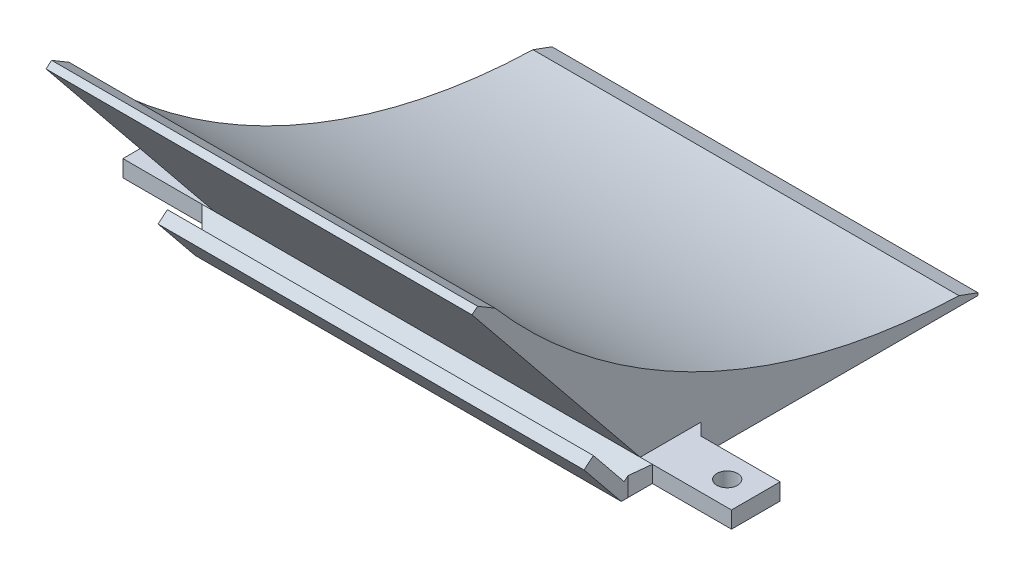
ISO-10303-21;
HEADER;
FILE_DESCRIPTION(('STEP AP214'),'2;1');
FILE_NAME('part.step','',(''),(''),'','','');
FILE_SCHEMA(('AUTOMOTIVE_DESIGN { 1 0 10303 214 1 1 1 1 }'));
ENDSEC;
DATA;
#1=APPLICATION_CONTEXT('core data for automotive mechanical design processes');
#2=APPLICATION_PROTOCOL_DEFINITION('international standard','automotive_design',2000,#1);
#3=PRODUCT_CONTEXT('',#1,'mechanical');
#4=PRODUCT('Part','Part','',(#3));
#5=PRODUCT_RELATED_PRODUCT_CATEGORY('part','',(#4));
#6=PRODUCT_DEFINITION_FORMATION('','',#4);
#7=PRODUCT_DEFINITION_CONTEXT('part definition',#1,'design');
#8=PRODUCT_DEFINITION('design','',#6,#7);
#9=PRODUCT_DEFINITION_SHAPE('','',#8);
#10=(LENGTH_UNIT() NAMED_UNIT(*) SI_UNIT(.MILLI.,.METRE.));
#11=(NAMED_UNIT(*) PLANE_ANGLE_UNIT() SI_UNIT($,.RADIAN.));
#12=(NAMED_UNIT(*) SI_UNIT($,.STERADIAN.) SOLID_ANGLE_UNIT());
#13=UNCERTAINTY_MEASURE_WITH_UNIT(LENGTH_MEASURE(1.E-05),#10,'distance_accuracy_value','');
#14=(GEOMETRIC_REPRESENTATION_CONTEXT(3) GLOBAL_UNCERTAINTY_ASSIGNED_CONTEXT((#13)) GLOBAL_UNIT_ASSIGNED_CONTEXT((#10,
#11,#12)) REPRESENTATION_CONTEXT('',''));
#15=CARTESIAN_POINT('',(0.,0.,0.));
#16=DIRECTION('',(0.,0.,1.));
#17=DIRECTION('',(1.,0.,0.));
#18=AXIS2_PLACEMENT_3D('',#15,#16,#17);
#19=CARTESIAN_POINT('',(93.0034101612467,0.,2.97609480169215E-07));
#20=DIRECTION('',(-1.,0.,-3.19998459898651E-09));
#21=DIRECTION('',(-3.19998459898651E-09,0.,1.));
#22=AXIS2_PLACEMENT_3D('',#19,#20,#21);
#23=PLANE('',#22);
#24=DIRECTION('',(3.19998459898651E-09,0.,-1.));
#25=VECTOR('',#24,1.);
#26=CARTESIAN_POINT('',(93.0034101612467,0.999999999999985,2.97609480172915E-07));
#27=LINE('',#26,#25);
#28=CARTESIAN_POINT('',(93.0034095293777,0.999999999999985,197.460010795194));
#29=VERTEX_POINT('',#28);
#30=CARTESIAN_POINT('',(93.0034096750054,0.999999999999985,151.951123028116));
#31=VERTEX_POINT('',#30);
#32=EDGE_CURVE('E284',#29,#31,#27,.T.);
#33=ORIENTED_EDGE('',*,*,#32,.F.);
#34=DIRECTION('',(0.,1.,0.));
#35=VECTOR('',#34,1.);
#36=CARTESIAN_POINT('',(93.0034095293777,0.,197.460010795194));
#37=LINE('',#36,#35);
#38=CARTESIAN_POINT('',(93.0034095293777,5.74424538952321,197.460010795194));
#39=VERTEX_POINT('',#38);
#40=EDGE_CURVE('E362',#29,#39,#37,.T.);
#41=ORIENTED_EDGE('',*,*,#40,.T.);
#42=DIRECTION('',(3.19998368081275E-09,0.,-1.));
#43=VECTOR('',#42,1.);
#44=CARTESIAN_POINT('',(93.0034094973779,5.74424538952321,207.460010795194));
#45=LINE('',#44,#43);
#46=CARTESIAN_POINT('',(93.0034094973779,5.74424538952321,207.460010795194));
#47=VERTEX_POINT('',#46);
#48=EDGE_CURVE('E239',#47,#39,#45,.T.);
#49=ORIENTED_EDGE('',*,*,#48,.F.);
#50=DIRECTION('',(-2.01555107096731E-09,0.77670642359196,0.629862787876047));
#51=VECTOR('',#50,1.);
#52=CARTESIAN_POINT('',(93.0034097697452,-99.2143716153096,122.344804959122));
#53=LINE('',#52,#51);
#54=CARTESIAN_POINT('',(93.0034094089462,39.8219958374402,235.095042835298));
#55=VERTEX_POINT('',#54);
#56=EDGE_CURVE('E259',#47,#55,#53,.T.);
#57=ORIENTED_EDGE('',*,*,#56,.T.);
#58=DIRECTION('',(2.48544871483468E-09,0.629862787876053,-0.776706423591956));
#59=VECTOR('',#58,1.);
#60=CARTESIAN_POINT('',(93.0034098004477,139.03636745275,112.750238173787));
#61=LINE('',#60,#59);
#62=CARTESIAN_POINT('',(93.0034094119287,40.5778311829227,234.162995126949));
#63=VERTEX_POINT('',#62);
#64=EDGE_CURVE('E291',#55,#63,#61,.T.);
#65=ORIENTED_EDGE('',*,*,#64,.T.);
#66=DIRECTION('',(-2.74798043931777E-09,0.512398072449269,0.858748051147876));
#67=VECTOR('',#66,1.);
#68=CARTESIAN_POINT('',(93.0034100216479,-73.11254992798,43.624820877839));
#69=LINE('',#68,#67);
#70=CARTESIAN_POINT('',(93.0034094210821,38.8710573351574,231.30254581161));
#71=VERTEX_POINT('',#70);
#72=EDGE_CURVE('E339',#63,#71,#69,.F.);
#73=ORIENTED_EDGE('',*,*,#72,.T.);
#74=CARTESIAN_POINT('',(93.0034096750055,107.24677762627,151.951123028154));
#75=DIRECTION('',(-1.,0.,-3.19998459898651E-09));
#76=DIRECTION('',(-3.19998459898651E-09,0.,1.));
#77=AXIS2_PLACEMENT_3D('',#74,#75,#76);
#78=CIRCLE('',#77,104.74677762627);
#79=CARTESIAN_POINT('',(93.003409664998,2.54669602360964,155.078475819817));
#80=VERTEX_POINT('',#79);
#81=EDGE_CURVE('E263',#71,#80,#78,.F.);
#82=ORIENTED_EDGE('',*,*,#81,.T.);
#83=DIRECTION('',(-3.00438968483501E-09,0.34425464915842,0.93887631588661));
#84=VECTOR('',#83,1.);
#85=CARTESIAN_POINT('',(93.0034101050696,-47.8784236053665,17.5554222862437));
#86=LINE('',#85,#84);
#87=CARTESIAN_POINT('',(93.0034096750054,1.4,151.951123028154));
#88=VERTEX_POINT('',#87);
#89=EDGE_CURVE('E329',#80,#88,#86,.F.);
#90=ORIENTED_EDGE('',*,*,#89,.T.);
#91=DIRECTION('',(0.,1.,0.));
#92=VECTOR('',#91,1.);
#93=CARTESIAN_POINT('',(93.0034096750054,0.,151.951123028154));
#94=LINE('',#93,#92);
#95=EDGE_CURVE('E285',#31,#88,#94,.T.);
#96=ORIENTED_EDGE('',*,*,#95,.F.);
#97=EDGE_LOOP('',(#33,#41,#49,#57,#65,#73,#82,#90,#96));
#98=FACE_BOUND('',#97,.T.);
#99=ADVANCED_FACE('F43',(#98),#23,.T.);
#100=CARTESIAN_POINT('',(163.003409506555,1.89008199867561,204.592010922145));
#101=DIRECTION('',(1.,0.,3.19998458286896E-09));
#102=DIRECTION('',(2.01555108117863E-09,-0.776706423591956,-0.629862787876052));
#103=AXIS2_PLACEMENT_3D('',#100,#101,#102);
#104=PLANE('',#103);
#105=DIRECTION('',(3.19998458286896E-09,0.,-1.));
#106=VECTOR('',#105,1.);
#107=CARTESIAN_POINT('',(163.003410161247,0.999999999999974,5.21608400973742E-07));
#108=LINE('',#107,#106);
#109=CARTESIAN_POINT('',(163.003409487442,0.999999999999973,210.565143832562));
#110=VERTEX_POINT('',#109);
#111=CARTESIAN_POINT('',(163.003409490978,0.999999999999973,209.460011019193));
#112=VERTEX_POINT('',#111);
#113=EDGE_CURVE('E311',#110,#112,#108,.T.);
#114=ORIENTED_EDGE('',*,*,#113,.T.);
#115=DIRECTION('',(0.,1.,0.));
#116=VECTOR('',#115,1.);
#117=CARTESIAN_POINT('',(163.003409490978,5.7442453895232,209.460011019193));
#118=LINE('',#117,#116);
#119=CARTESIAN_POINT('',(163.003409490978,4.12236415165955,209.460011019193));
#120=VERTEX_POINT('',#119);
#121=EDGE_CURVE('E349',#112,#120,#118,.T.);
#122=ORIENTED_EDGE('',*,*,#121,.T.);
#123=DIRECTION('',(-2.48544868580293E-09,-0.629862787875993,0.776706423592004));
#124=VECTOR('',#123,1.);
#125=CARTESIAN_POINT('',(163.003409888879,104.958617004799,85.1152063577045));
#126=LINE('',#125,#124);
#127=CARTESIAN_POINT('',(163.003409488927,3.6027119106877,210.100812859423));
#128=VERTEX_POINT('',#127);
#129=EDGE_CURVE('E258',#120,#128,#126,.T.);
#130=ORIENTED_EDGE('',*,*,#129,.T.);
#131=DIRECTION('',(-2.01555108117863E-09,0.776706423591957,0.629862787876052));
#132=VECTOR('',#131,1.);
#133=CARTESIAN_POINT('',(163.003409761295,-101.355905094088,124.985607023333));
#134=LINE('',#133,#132);
#135=CARTESIAN_POINT('',(163.003409472803,9.8163634810992,215.139714938454));
#136=VERTEX_POINT('',#135);
#137=EDGE_CURVE('E304',#128,#136,#134,.T.);
#138=ORIENTED_EDGE('',*,*,#137,.T.);
#139=DIRECTION('',(-2.48544868580277E-09,-0.629862787876053,0.776706423591956));
#140=VECTOR('',#139,1.);
#141=CARTESIAN_POINT('',(163.003409872755,111.172268393538,90.1541086607286));
#142=LINE('',#141,#140);
#143=CARTESIAN_POINT('',(163.003409467832,8.55663772367128,216.693128009615));
#144=VERTEX_POINT('',#143);
#145=EDGE_CURVE('E306',#136,#144,#142,.T.);
#146=ORIENTED_EDGE('',*,*,#145,.T.);
#147=DIRECTION('',(2.01555108117863E-09,-0.776706423591957,-0.629862787876052));
#148=VECTOR('',#147,1.);
#149=CARTESIAN_POINT('',(163.003409756324,-102.615630669841,126.539019870517));
#150=LINE('',#149,#148);
#151=EDGE_CURVE('E308',#144,#110,#150,.T.);
#152=ORIENTED_EDGE('',*,*,#151,.T.);
#153=EDGE_LOOP('',(#114,#122,#130,#138,#146,#152));
#154=FACE_BOUND('',#153,.T.);
#155=ADVANCED_FACE('F447',(#154),#104,.T.);
#156=DIRECTION('',(3.19998550104272E-09,0.,-1.));
#157=VECTOR('',#156,1.);
#158=CARTESIAN_POINT('',(163.003409497378,5.7442453895232,207.460011019193));
#159=LINE('',#158,#157);
#160=CARTESIAN_POINT('',(163.003409497378,5.7442453895232,207.460011019193));
#161=VERTEX_POINT('',#160);
#162=CARTESIAN_POINT('',(163.003409529378,5.7442453895232,197.460011019193));
#163=VERTEX_POINT('',#162);
#164=EDGE_CURVE('E215',#161,#163,#159,.T.);
#165=ORIENTED_EDGE('',*,*,#164,.T.);
#166=DIRECTION('',(0.,-1.,0.));
#167=VECTOR('',#166,1.);
#168=CARTESIAN_POINT('',(163.003409529378,2.99999999999996,197.460011019193));
#169=LINE('',#168,#167);
#170=CARTESIAN_POINT('',(163.003409529378,0.999999999999973,197.460011019193));
#171=VERTEX_POINT('',#170);
#172=EDGE_CURVE('E345',#163,#171,#169,.T.);
#173=ORIENTED_EDGE('',*,*,#172,.T.);
#174=CARTESIAN_POINT('',(163.003409675005,0.999999999999957,151.951123252153));
#175=VERTEX_POINT('',#174);
#176=EDGE_CURVE('E310',#171,#175,#108,.T.);
#177=ORIENTED_EDGE('',*,*,#176,.T.);
#178=DIRECTION('',(0.,1.,0.));
#179=VECTOR('',#178,1.);
#180=CARTESIAN_POINT('',(163.003409675005,0.,151.951123252153));
#181=LINE('',#180,#179);
#182=CARTESIAN_POINT('',(163.003409675005,1.39999999999997,151.951123252153));
#183=VERTEX_POINT('',#182);
#184=EDGE_CURVE('E294',#175,#183,#181,.T.);
#185=ORIENTED_EDGE('',*,*,#184,.T.);
#186=DIRECTION('',(3.00438967872805E-09,-0.34425464915842,-0.93887631588661));
#187=VECTOR('',#186,1.);
#188=CARTESIAN_POINT('',(163.003409526012,18.4722750763339,198.511873460337));
#189=LINE('',#188,#187);
#190=CARTESIAN_POINT('',(163.003409664998,2.54669602360962,155.078476043816));
#191=VERTEX_POINT('',#190);
#192=EDGE_CURVE('E333',#183,#191,#189,.F.);
#193=ORIENTED_EDGE('',*,*,#192,.T.);
#194=CARTESIAN_POINT('',(163.003409675005,107.24677762627,151.951123252153));
#195=DIRECTION('',(1.,0.,3.19998458286896E-09));
#196=DIRECTION('',(3.19998458286896E-09,0.,-1.));
#197=AXIS2_PLACEMENT_3D('',#194,#195,#196);
#198=CIRCLE('',#197,104.74677762627);
#199=CARTESIAN_POINT('',(163.003409421082,38.8710573351574,231.302546035609));
#200=VERTEX_POINT('',#199);
#201=EDGE_CURVE('E262',#200,#191,#198,.T.);
#202=ORIENTED_EDGE('',*,*,#201,.F.);
#203=DIRECTION('',(2.74798043891055E-09,-0.512398072449269,-0.858748051147876));
#204=VECTOR('',#203,1.);
#205=CARTESIAN_POINT('',(163.003409536186,17.4084440013254,195.332509526946));
#206=LINE('',#205,#204);
#207=CARTESIAN_POINT('',(163.003409411929,40.5778311829227,234.162995350948));
#208=VERTEX_POINT('',#207);
#209=EDGE_CURVE('E343',#200,#208,#206,.F.);
#210=ORIENTED_EDGE('',*,*,#209,.T.);
#211=DIRECTION('',(2.48544868580277E-09,0.629862787876053,-0.776706423591956));
#212=VECTOR('',#211,1.);
#213=CARTESIAN_POINT('',(163.003409800448,139.03636745275,112.750238397786));
#214=LINE('',#213,#212);
#215=CARTESIAN_POINT('',(163.003409408946,39.8219958374402,235.095043059297));
#216=VERTEX_POINT('',#215);
#217=EDGE_CURVE('E296',#216,#208,#214,.T.);
#218=ORIENTED_EDGE('',*,*,#217,.F.);
#219=DIRECTION('',(-2.01555108117861E-09,0.77670642359196,0.629862787876047));
#220=VECTOR('',#219,1.);
#221=CARTESIAN_POINT('',(163.003409769745,-99.2143716153096,122.344805183121));
#222=LINE('',#221,#220);
#223=EDGE_CURVE('E266',#161,#216,#222,.T.);
#224=ORIENTED_EDGE('',*,*,#223,.F.);
#225=EDGE_LOOP('',(#165,#173,#177,#185,#193,#202,#210,#218,#224));
#226=FACE_BOUND('',#225,.T.);
#227=ADVANCED_FACE('F470',(#226),#104,.T.);
#228=DIRECTION('',(-2.48544871483483E-09,-0.629862787875993,0.776706423592004));
#229=VECTOR('',#228,1.);
#230=CARTESIAN_POINT('',(93.0034098888794,104.958617004799,85.1152061337055));
#231=LINE('',#230,#229);
#232=CARTESIAN_POINT('',(93.0034094909779,4.12236415165962,209.460010795194));
#233=VERTEX_POINT('',#232);
#234=CARTESIAN_POINT('',(93.0034094889273,3.60271191068774,210.100812635477));
#235=VERTEX_POINT('',#234);
#236=EDGE_CURVE('E264',#233,#235,#231,.T.);
#237=ORIENTED_EDGE('',*,*,#236,.F.);
#238=DIRECTION('',(0.,-1.,0.));
#239=VECTOR('',#238,1.);
#240=CARTESIAN_POINT('',(93.0034094909779,0.,209.460010795194));
#241=LINE('',#240,#239);
#242=CARTESIAN_POINT('',(93.0034094909779,0.999999999999984,209.460010795194));
#243=VERTEX_POINT('',#242);
#244=EDGE_CURVE('E360',#233,#243,#241,.T.);
#245=ORIENTED_EDGE('',*,*,#244,.T.);
#246=CARTESIAN_POINT('',(93.0034094874415,0.999999999999973,210.565143312938));
#247=VERTEX_POINT('',#246);
#248=EDGE_CURVE('E280',#247,#243,#27,.T.);
#249=ORIENTED_EDGE('',*,*,#248,.F.);
#250=DIRECTION('',(2.01555107096733E-09,-0.776706423591957,-0.629862787876052));
#251=VECTOR('',#250,1.);
#252=CARTESIAN_POINT('',(93.0034097563238,-102.61563066984,126.539019646518));
#253=LINE('',#252,#251);
#254=CARTESIAN_POINT('',(93.003409467832,8.55663772367128,216.69312778567));
#255=VERTEX_POINT('',#254);
#256=EDGE_CURVE('E276',#255,#247,#253,.T.);
#257=ORIENTED_EDGE('',*,*,#256,.F.);
#258=DIRECTION('',(-2.48544871483468E-09,-0.629862787876053,0.776706423591956));
#259=VECTOR('',#258,1.);
#260=CARTESIAN_POINT('',(93.003409872755,111.172268393538,90.1541084367296));
#261=LINE('',#260,#259);
#262=CARTESIAN_POINT('',(93.0034094728029,9.81636329944934,215.139714938454));
#263=VERTEX_POINT('',#262);
#264=EDGE_CURVE('E272',#263,#255,#261,.T.);
#265=ORIENTED_EDGE('',*,*,#264,.F.);
#266=DIRECTION('',(-2.01555107096733E-09,0.776706423591957,0.629862787876052));
#267=VECTOR('',#266,1.);
#268=CARTESIAN_POINT('',(93.0034097612947,-101.355905094088,124.985606799334));
#269=LINE('',#268,#267);
#270=EDGE_CURVE('E268',#235,#263,#269,.T.);
#271=ORIENTED_EDGE('',*,*,#270,.F.);
#272=EDGE_LOOP('',(#237,#245,#249,#257,#265,#271));
#273=FACE_BOUND('',#272,.T.);
#274=ADVANCED_FACE('F434',(#273),#23,.T.);
#275=CARTESIAN_POINT('',(255.386520083065,107.24677762627,151.951123547777));
#276=DIRECTION('',(-1.,0.,-3.19998458286896E-09));
#277=DIRECTION('',(-3.19998458286896E-09,0.,1.));
#278=AXIS2_PLACEMENT_3D('',#275,#276,#277);
#279=CYLINDRICAL_SURFACE('',#278,104.74677762627);
#280=ORIENTED_EDGE('',*,*,#81,.F.);
#281=DIRECTION('',(-1.,0.,-3.19998458286896E-09));
#282=VECTOR('',#281,1.);
#283=CARTESIAN_POINT('',(255.386519829141,38.8710573351574,231.302546331234));
#284=LINE('',#283,#282);
#285=EDGE_CURVE('E341',#71,#200,#284,.F.);
#286=ORIENTED_EDGE('',*,*,#285,.T.);
#287=ORIENTED_EDGE('',*,*,#201,.T.);
#288=DIRECTION('',(-1.,0.,-3.19998458286896E-09));
#289=VECTOR('',#288,1.);
#290=CARTESIAN_POINT('',(255.386520073057,2.54669602360963,155.07847633944));
#291=LINE('',#290,#289);
#292=EDGE_CURVE('E299',#191,#80,#291,.T.);
#293=ORIENTED_EDGE('',*,*,#292,.T.);
#294=EDGE_LOOP('',(#280,#286,#287,#293));
#295=FACE_BOUND('',#294,.T.);
#296=ADVANCED_FACE('F483',(#295),#279,.F.);
#297=CARTESIAN_POINT('',(255.386520083065,0.,151.951123547777));
#298=DIRECTION('',(-3.19998458286896E-09,0.,1.));
#299=DIRECTION('',(1.,0.,3.19998458286896E-09));
#300=AXIS2_PLACEMENT_3D('',#297,#298,#299);
#301=PLANE('',#300);
#302=ORIENTED_EDGE('',*,*,#95,.T.);
#303=DIRECTION('',(1.,0.,3.19998458286896E-09));
#304=VECTOR('',#303,1.);
#305=CARTESIAN_POINT('',(163.003409675006,1.39999999999997,151.951123252153));
#306=LINE('',#305,#304);
#307=EDGE_CURVE('E331',#88,#183,#306,.T.);
#308=ORIENTED_EDGE('',*,*,#307,.T.);
#309=ORIENTED_EDGE('',*,*,#184,.F.);
#310=DIRECTION('',(-1.,0.,-3.19998458286896E-09));
#311=VECTOR('',#310,1.);
#312=CARTESIAN_POINT('',(255.386520083065,0.999999999999957,151.951123547739));
#313=LINE('',#312,#311);
#314=EDGE_CURVE('E289',#175,#31,#313,.T.);
#315=ORIENTED_EDGE('',*,*,#314,.T.);
#316=EDGE_LOOP('',(#302,#308,#309,#315));
#317=FACE_BOUND('',#316,.T.);
#318=ADVANCED_FACE('F473',(#317),#301,.F.);
#319=CARTESIAN_POINT('',(255.386520569306,0.999999999999958,8.17232929997013E-07));
#320=DIRECTION('',(0.,1.,0.));
#321=DIRECTION('',(-1.,0.,0.));
#322=AXIS2_PLACEMENT_3D('',#319,#320,#321);
#323=PLANE('',#322);
#324=ORIENTED_EDGE('',*,*,#113,.F.);
#325=DIRECTION('',(-1.,0.,-3.19998458286896E-09));
#326=VECTOR('',#325,1.);
#327=CARTESIAN_POINT('',(255.386519895501,0.999999999999946,210.565143832562));
#328=LINE('',#327,#326);
#329=EDGE_CURVE('E288',#110,#247,#328,.T.);
#330=ORIENTED_EDGE('',*,*,#329,.T.);
#331=ORIENTED_EDGE('',*,*,#248,.T.);
#332=EDGE_CURVE('E283',#243,#29,#27,.T.);
#333=ORIENTED_EDGE('',*,*,#332,.T.);
#334=ORIENTED_EDGE('',*,*,#32,.T.);
#335=ORIENTED_EDGE('',*,*,#314,.F.);
#336=ORIENTED_EDGE('',*,*,#176,.F.);
#337=EDGE_CURVE('E314',#112,#171,#108,.T.);
#338=ORIENTED_EDGE('',*,*,#337,.F.);
#339=EDGE_LOOP('',(#324,#330,#331,#333,#334,#335,#336,#338));
#340=FACE_BOUND('',#339,.T.);
#341=ADVANCED_FACE('F428',(#340),#323,.F.);
#342=CARTESIAN_POINT('',(255.386520164383,-102.615630669841,126.539020166141));
#343=DIRECTION('',(2.48544868580278E-09,0.629862787876052,-0.776706423591957));
#344=DIRECTION('',(0.,0.776706423591957,0.629862787876052));
#345=AXIS2_PLACEMENT_3D('',#342,#343,#344);
#346=PLANE('',#345);
#347=ORIENTED_EDGE('',*,*,#151,.F.);
#348=DIRECTION('',(-1.,0.,-3.19998458286896E-09));
#349=VECTOR('',#348,1.);
#350=CARTESIAN_POINT('',(255.386519875891,8.55663772367125,216.693128305293));
#351=LINE('',#350,#349);
#352=EDGE_CURVE('E279',#144,#255,#351,.T.);
#353=ORIENTED_EDGE('',*,*,#352,.T.);
#354=ORIENTED_EDGE('',*,*,#256,.T.);
#355=ORIENTED_EDGE('',*,*,#329,.F.);
#356=EDGE_LOOP('',(#347,#353,#354,#355));
#357=FACE_BOUND('',#356,.T.);
#358=ADVANCED_FACE('F656',(#357),#346,.F.);
#359=CARTESIAN_POINT('',(255.386520280814,111.172268393538,90.1541089563531));
#360=DIRECTION('',(2.01555108117863E-09,-0.776706423591956,-0.629862787876053));
#361=DIRECTION('',(0.,0.629862787876053,-0.776706423591956));
#362=AXIS2_PLACEMENT_3D('',#359,#360,#361);
#363=PLANE('',#362);
#364=ORIENTED_EDGE('',*,*,#145,.F.);
#365=DIRECTION('',(-1.,0.,-3.19998458286896E-09));
#366=VECTOR('',#365,1.);
#367=CARTESIAN_POINT('',(255.386519880862,9.81636329944931,215.139715458077));
#368=LINE('',#367,#366);
#369=EDGE_CURVE('E275',#136,#263,#368,.T.);
#370=ORIENTED_EDGE('',*,*,#369,.T.);
#371=ORIENTED_EDGE('',*,*,#264,.T.);
#372=ORIENTED_EDGE('',*,*,#352,.F.);
#373=EDGE_LOOP('',(#364,#370,#371,#372));
#374=FACE_BOUND('',#373,.T.);
#375=ADVANCED_FACE('F674',(#374),#363,.F.);
#376=CARTESIAN_POINT('',(255.386520169354,-101.355905094088,124.985607318957));
#377=DIRECTION('',(-2.48544868580278E-09,-0.629862787876052,0.776706423591957));
#378=DIRECTION('',(0.,-0.776706423591957,-0.629862787876052));
#379=AXIS2_PLACEMENT_3D('',#376,#377,#378);
#380=PLANE('',#379);
#381=ORIENTED_EDGE('',*,*,#137,.F.);
#382=DIRECTION('',(-1.,0.,-3.19998458286896E-09));
#383=VECTOR('',#382,1.);
#384=CARTESIAN_POINT('',(255.386519896987,3.60271191068772,210.100813155101));
#385=LINE('',#384,#383);
#386=EDGE_CURVE('E271',#128,#235,#385,.T.);
#387=ORIENTED_EDGE('',*,*,#386,.T.);
#388=ORIENTED_EDGE('',*,*,#270,.T.);
#389=ORIENTED_EDGE('',*,*,#369,.F.);
#390=EDGE_LOOP('',(#381,#387,#388,#389));
#391=FACE_BOUND('',#390,.T.);
#392=ADVANCED_FACE('F443',(#391),#380,.F.);
#393=CARTESIAN_POINT('',(255.386520296939,104.958617004799,85.115206653329));
#394=DIRECTION('',(2.01555108117844E-09,-0.776706423592004,-0.629862787875993));
#395=DIRECTION('',(0.,0.629862787875993,-0.776706423592004));
#396=AXIS2_PLACEMENT_3D('',#393,#394,#395);
#397=PLANE('',#396);
#398=ORIENTED_EDGE('',*,*,#129,.F.);
#399=DIRECTION('',(-0.61341328387251,-0.497441746492763,0.613413279946704));
#400=VECTOR('',#399,1.);
#401=CARTESIAN_POINT('',(275.321800697862,95.2059095429296,97.1416205311395));
#402=LINE('',#401,#400);
#403=CARTESIAN_POINT('',(165.003409497378,5.7442453895232,207.460011025593));
#404=VERTEX_POINT('',#403);
#405=EDGE_CURVE('E370',#120,#404,#402,.F.);
#406=ORIENTED_EDGE('',*,*,#405,.T.);
#407=DIRECTION('',(1.,0.,3.19998458286896E-09));
#408=VECTOR('',#407,1.);
#409=CARTESIAN_POINT('',(255.386519905437,5.74424538952319,207.460011314817));
#410=LINE('',#409,#408);
#411=EDGE_CURVE('E54',#161,#404,#410,.T.);
#412=ORIENTED_EDGE('',*,*,#411,.F.);
#413=DIRECTION('',(-1.,0.,-3.19998458286896E-09));
#414=VECTOR('',#413,1.);
#415=CARTESIAN_POINT('',(255.386519905437,5.74424538952319,207.460011314817));
#416=LINE('',#415,#414);
#417=EDGE_CURVE('E267',#161,#47,#416,.T.);
#418=ORIENTED_EDGE('',*,*,#417,.T.);
#419=DIRECTION('',(-1.,0.,-3.19998461519846E-09));
#420=VECTOR('',#419,1.);
#421=CARTESIAN_POINT('',(255.386519905437,5.74424538952319,207.460011314817));
#422=LINE('',#421,#420);
#423=CARTESIAN_POINT('',(91.0034094973779,5.74424538952321,207.460010788794));
#424=VERTEX_POINT('',#423);
#425=EDGE_CURVE('E11',#47,#424,#422,.T.);
#426=ORIENTED_EDGE('',*,*,#425,.T.);
#427=DIRECTION('',(0.613413279946699,-0.497441746492756,0.613413283872521));
#428=VECTOR('',#427,1.);
#429=CARTESIAN_POINT('',(76.547396111902,17.4672138691404,193.0039973108));
#430=LINE('',#429,#428);
#431=EDGE_CURVE('E377',#424,#233,#430,.T.);
#432=ORIENTED_EDGE('',*,*,#431,.T.);
#433=ORIENTED_EDGE('',*,*,#236,.T.);
#434=ORIENTED_EDGE('',*,*,#386,.F.);
#435=EDGE_LOOP('',(#398,#406,#412,#418,#426,#432,#433,#434));
#436=FACE_BOUND('',#435,.T.);
#437=ADVANCED_FACE('F440',(#436),#397,.F.);
#438=CARTESIAN_POINT('',(255.386520177804,-99.2143716153096,122.344805478746));
#439=DIRECTION('',(-2.48544868580279E-09,-0.629862787876047,0.77670642359196));
#440=DIRECTION('',(0.,-0.77670642359196,-0.629862787876047));
#441=AXIS2_PLACEMENT_3D('',#438,#439,#440);
#442=PLANE('',#441);
#443=ORIENTED_EDGE('',*,*,#417,.F.);
#444=ORIENTED_EDGE('',*,*,#223,.T.);
#445=DIRECTION('',(-1.,0.,-3.19998458286896E-09));
#446=VECTOR('',#445,1.);
#447=CARTESIAN_POINT('',(255.386519817005,39.8219958374402,235.095043354922));
#448=LINE('',#447,#446);
#449=EDGE_CURVE('E300',#216,#55,#448,.T.);
#450=ORIENTED_EDGE('',*,*,#449,.T.);
#451=ORIENTED_EDGE('',*,*,#56,.F.);
#452=EDGE_LOOP('',(#443,#444,#450,#451));
#453=FACE_BOUND('',#452,.T.);
#454=ADVANCED_FACE('F496',(#453),#442,.T.);
#455=CARTESIAN_POINT('',(255.386520208507,139.03636745275,112.750238693411));
#456=DIRECTION('',(-2.01555108117863E-09,0.776706423591956,0.629862787876053));
#457=DIRECTION('',(0.,-0.629862787876053,0.776706423591956));
#458=AXIS2_PLACEMENT_3D('',#455,#456,#457);
#459=PLANE('',#458);
#460=ORIENTED_EDGE('',*,*,#217,.T.);
#461=DIRECTION('',(-1.,0.,-3.19998488997594E-09));
#462=VECTOR('',#461,1.);
#463=CARTESIAN_POINT('',(255.386519819988,40.5778311829227,234.162995646573));
#464=LINE('',#463,#462);
#465=EDGE_CURVE('E336',#208,#63,#464,.T.);
#466=ORIENTED_EDGE('',*,*,#465,.T.);
#467=ORIENTED_EDGE('',*,*,#64,.F.);
#468=ORIENTED_EDGE('',*,*,#449,.F.);
#469=EDGE_LOOP('',(#460,#466,#467,#468));
#470=FACE_BOUND('',#469,.T.);
#471=ADVANCED_FACE('F491',(#470),#459,.T.);
#472=CARTESIAN_POINT('',(255.386520073057,2.54669602360964,155.07847633944));
#473=DIRECTION('',(-1.10160972624222E-09,-0.93887631588661,0.344254649158419));
#474=DIRECTION('',(-1.,0.,-3.19998458286896E-09));
#475=AXIS2_PLACEMENT_3D('',#472,#473,#474);
#476=PLANE('',#475);
#477=ORIENTED_EDGE('',*,*,#192,.F.);
#478=ORIENTED_EDGE('',*,*,#307,.F.);
#479=ORIENTED_EDGE('',*,*,#89,.F.);
#480=ORIENTED_EDGE('',*,*,#292,.F.);
#481=EDGE_LOOP('',(#477,#478,#479,#480));
#482=FACE_BOUND('',#481,.T.);
#483=ADVANCED_FACE('F479',(#482),#476,.F.);
#484=CARTESIAN_POINT('',(255.386519819988,40.5778311829227,234.162995646573));
#485=DIRECTION('',(-1.63966607513971E-09,-0.858748051147875,0.512398072449268));
#486=DIRECTION('',(-1.,0.,-3.19998458286896E-09));
#487=AXIS2_PLACEMENT_3D('',#484,#485,#486);
#488=PLANE('',#487);
#489=ORIENTED_EDGE('',*,*,#209,.F.);
#490=ORIENTED_EDGE('',*,*,#285,.F.);
#491=ORIENTED_EDGE('',*,*,#72,.F.);
#492=ORIENTED_EDGE('',*,*,#465,.F.);
#493=EDGE_LOOP('',(#489,#490,#491,#492));
#494=FACE_BOUND('',#493,.T.);
#495=ADVANCED_FACE('F488',(#494),#488,.F.);
#496=CARTESIAN_POINT('',(78.0034094973779,5.74424538952322,207.460010747194));
#497=DIRECTION('',(3.19998459898651E-09,0.,-1.));
#498=DIRECTION('',(-1.,0.,-3.19998459898651E-09));
#499=AXIS2_PLACEMENT_3D('',#496,#497,#498);
#500=PLANE('',#499);
#501=DIRECTION('',(1.,0.,3.19998459898651E-09));
#502=VECTOR('',#501,1.);
#503=CARTESIAN_POINT('',(78.0034094973779,2.99999999999998,207.460010747194));
#504=LINE('',#503,#502);
#505=CARTESIAN_POINT('',(78.0034094973779,2.99999999999998,207.460010747194));
#506=VERTEX_POINT('',#505);
#507=CARTESIAN_POINT('',(91.0034094973779,2.99999999999997,207.460010788794));
#508=VERTEX_POINT('',#507);
#509=EDGE_CURVE('E245',#506,#508,#504,.T.);
#510=ORIENTED_EDGE('',*,*,#509,.T.);
#511=DIRECTION('',(0.,1.,0.));
#512=VECTOR('',#511,1.);
#513=CARTESIAN_POINT('',(91.0034094973778,5.74424538952321,207.460010788794));
#514=LINE('',#513,#512);
#515=EDGE_CURVE('E365',#508,#424,#514,.T.);
#516=ORIENTED_EDGE('',*,*,#515,.T.);
#517=DIRECTION('',(1.,0.,3.19998459898651E-09));
#518=VECTOR('',#517,1.);
#519=CARTESIAN_POINT('',(78.0034094973779,5.74424538952322,207.460010747194));
#520=LINE('',#519,#518);
#521=CARTESIAN_POINT('',(78.0034094973779,5.74424538952322,207.460010747194));
#522=VERTEX_POINT('',#521);
#523=EDGE_CURVE('E255',#522,#424,#520,.T.);
#524=ORIENTED_EDGE('',*,*,#523,.F.);
#525=DIRECTION('',(0.,1.,0.));
#526=VECTOR('',#525,1.);
#527=CARTESIAN_POINT('',(78.0034094973779,5.74424538952322,207.460010747194));
#528=LINE('',#527,#526);
#529=EDGE_CURVE('E235',#506,#522,#528,.T.);
#530=ORIENTED_EDGE('',*,*,#529,.F.);
#531=EDGE_LOOP('',(#510,#516,#524,#530));
#532=FACE_BOUND('',#531,.T.);
#533=ADVANCED_FACE('F405',(#532),#500,.F.);
#534=CARTESIAN_POINT('',(78.0034094973779,5.74424538952322,207.460010747194));
#535=DIRECTION('',(0.,-1.,0.));
#536=DIRECTION('',(1.,0.,0.));
#537=AXIS2_PLACEMENT_3D('',#534,#535,#536);
#538=PLANE('',#537);
#539=CARTESIAN_POINT('',(82.7034095101778,5.74424538952322,203.460010747194));
#540=DIRECTION('',(0.,1.,0.));
#541=DIRECTION('',(0.,0.,1.));
#542=AXIS2_PLACEMENT_3D('',#539,#540,#541);
#543=CIRCLE('',#542,1.69999999999999);
#544=CARTESIAN_POINT('',(82.7034095101778,5.74424538952322,205.160010747194));
#545=VERTEX_POINT('',#544);
#546=EDGE_CURVE('E204',#545,#545,#543,.T.);
#547=ORIENTED_EDGE('',*,*,#546,.F.);
#548=EDGE_LOOP('',(#547));
#549=FACE_BOUND('',#548,.T.);
#550=ORIENTED_EDGE('',*,*,#48,.T.);
#551=DIRECTION('',(-0.707106783449277,0.,0.707106778923818));
#552=VECTOR('',#551,1.);
#553=CARTESIAN_POINT('',(80.5034094893779,5.74424538952322,209.960010755194));
#554=LINE('',#553,#552);
#555=CARTESIAN_POINT('',(91.0034095229777,5.74424538952321,199.460010788794));
#556=VERTEX_POINT('',#555);
#557=EDGE_CURVE('E375',#39,#556,#554,.T.);
#558=ORIENTED_EDGE('',*,*,#557,.T.);
#559=DIRECTION('',(1.,0.,3.19998459898651E-09));
#560=VECTOR('',#559,1.);
#561=CARTESIAN_POINT('',(78.0034095229777,5.74424538952322,199.460010747194));
#562=LINE('',#561,#560);
#563=CARTESIAN_POINT('',(78.0034095229777,5.74424538952322,199.460010747194));
#564=VERTEX_POINT('',#563);
#565=EDGE_CURVE('E252',#564,#556,#562,.T.);
#566=ORIENTED_EDGE('',*,*,#565,.F.);
#567=DIRECTION('',(3.19998368081275E-09,0.,-1.));
#568=VECTOR('',#567,1.);
#569=CARTESIAN_POINT('',(78.0034094973779,5.74424538952322,207.460010747194));
#570=LINE('',#569,#568);
#571=EDGE_CURVE('E238',#522,#564,#570,.T.);
#572=ORIENTED_EDGE('',*,*,#571,.F.);
#573=ORIENTED_EDGE('',*,*,#523,.T.);
#574=ORIENTED_EDGE('',*,*,#425,.F.);
#575=EDGE_LOOP('',(#550,#558,#566,#572,#573,#574));
#576=FACE_BOUND('',#575,.T.);
#577=ADVANCED_FACE('F409',(#549,#576),#538,.F.);
#578=CARTESIAN_POINT('',(78.0034095229777,5.74424538952322,199.460010747194));
#579=DIRECTION('',(-3.19998459898651E-09,0.,1.));
#580=DIRECTION('',(1.,0.,3.19998459898651E-09));
#581=AXIS2_PLACEMENT_3D('',#578,#579,#580);
#582=PLANE('',#581);
#583=ORIENTED_EDGE('',*,*,#565,.T.);
#584=DIRECTION('',(0.,-1.,0.));
#585=VECTOR('',#584,1.);
#586=CARTESIAN_POINT('',(91.0034095229777,5.74424538952321,199.460010788794));
#587=LINE('',#586,#585);
#588=CARTESIAN_POINT('',(91.0034095229777,2.99999999999997,199.460010788794));
#589=VERTEX_POINT('',#588);
#590=EDGE_CURVE('E357',#556,#589,#587,.T.);
#591=ORIENTED_EDGE('',*,*,#590,.T.);
#592=DIRECTION('',(1.,0.,3.19998459898651E-09));
#593=VECTOR('',#592,1.);
#594=CARTESIAN_POINT('',(78.0034095229777,2.99999999999998,199.460010747194));
#595=LINE('',#594,#593);
#596=CARTESIAN_POINT('',(78.0034095229777,2.99999999999998,199.460010747194));
#597=VERTEX_POINT('',#596);
#598=EDGE_CURVE('E249',#597,#589,#595,.T.);
#599=ORIENTED_EDGE('',*,*,#598,.F.);
#600=DIRECTION('',(0.,-1.,0.));
#601=VECTOR('',#600,1.);
#602=CARTESIAN_POINT('',(78.0034095229777,5.74424538952322,199.460010747194));
#603=LINE('',#602,#601);
#604=EDGE_CURVE('E241',#564,#597,#603,.T.);
#605=ORIENTED_EDGE('',*,*,#604,.F.);
#606=EDGE_LOOP('',(#583,#591,#599,#605));
#607=FACE_BOUND('',#606,.T.);
#608=ADVANCED_FACE('F420',(#607),#582,.F.);
#609=CARTESIAN_POINT('',(78.0034094973779,2.99999999999998,207.460010747194));
#610=DIRECTION('',(0.,1.,0.));
#611=DIRECTION('',(-1.,0.,0.));
#612=AXIS2_PLACEMENT_3D('',#609,#610,#611);
#613=PLANE('',#612);
#614=CARTESIAN_POINT('',(82.7034095101778,2.99999999999998,203.460010747194));
#615=DIRECTION('',(0.,1.,0.));
#616=DIRECTION('',(-1.,0.,0.));
#617=AXIS2_PLACEMENT_3D('',#614,#615,#616);
#618=CIRCLE('',#617,1.69999999999999);
#619=CARTESIAN_POINT('',(81.0034095101778,2.99999999999998,203.460010747194));
#620=VERTEX_POINT('',#619);
#621=EDGE_CURVE('E234',#620,#620,#618,.T.);
#622=ORIENTED_EDGE('',*,*,#621,.T.);
#623=EDGE_LOOP('',(#622));
#624=FACE_BOUND('',#623,.T.);
#625=ORIENTED_EDGE('',*,*,#598,.T.);
#626=DIRECTION('',(-3.19998459898651E-09,0.,1.));
#627=VECTOR('',#626,1.);
#628=CARTESIAN_POINT('',(91.0034094973779,2.99999999999997,207.460010788794));
#629=LINE('',#628,#627);
#630=EDGE_CURVE('E368',#589,#508,#629,.T.);
#631=ORIENTED_EDGE('',*,*,#630,.T.);
#632=ORIENTED_EDGE('',*,*,#509,.F.);
#633=DIRECTION('',(-3.19998368081275E-09,0.,1.));
#634=VECTOR('',#633,1.);
#635=CARTESIAN_POINT('',(78.0034094973779,2.99999999999998,207.460010747194));
#636=LINE('',#635,#634);
#637=EDGE_CURVE('E243',#597,#506,#636,.T.);
#638=ORIENTED_EDGE('',*,*,#637,.F.);
#639=EDGE_LOOP('',(#625,#631,#632,#638));
#640=FACE_BOUND('',#639,.T.);
#641=ADVANCED_FACE('F418',(#624,#640),#613,.F.);
#642=CARTESIAN_POINT('',(78.0034101612465,0.,2.49609625791126E-07));
#643=DIRECTION('',(1.,0.,3.19998368081275E-09));
#644=DIRECTION('',(3.19998368081275E-09,0.,-1.));
#645=AXIS2_PLACEMENT_3D('',#642,#643,#644);
#646=PLANE('',#645);
#647=ORIENTED_EDGE('',*,*,#529,.T.);
#648=ORIENTED_EDGE('',*,*,#571,.T.);
#649=ORIENTED_EDGE('',*,*,#604,.T.);
#650=ORIENTED_EDGE('',*,*,#637,.T.);
#651=EDGE_LOOP('',(#647,#648,#649,#650));
#652=FACE_BOUND('',#651,.T.);
#653=ADVANCED_FACE('F414',(#652),#646,.F.);
#654=CARTESIAN_POINT('',(82.7034095101778,5.74424538952321,203.460010747194));
#655=DIRECTION('',(0.,1.,0.));
#656=DIRECTION('',(0.,0.,1.));
#657=AXIS2_PLACEMENT_3D('',#654,#655,#656);
#658=CYLINDRICAL_SURFACE('',#657,1.69999999999999);
#659=ORIENTED_EDGE('',*,*,#546,.T.);
#660=EDGE_LOOP('',(#659));
#661=FACE_BOUND('',#660,.T.);
#662=ORIENTED_EDGE('',*,*,#621,.F.);
#663=EDGE_LOOP('',(#662));
#664=FACE_BOUND('',#663,.T.);
#665=ADVANCED_FACE('F612',(#661,#664),#658,.F.);
#666=CARTESIAN_POINT('',(178.003409497378,5.7442453895232,207.460011067193));
#667=DIRECTION('',(-3.19998458286896E-09,0.,1.));
#668=DIRECTION('',(1.,0.,3.19998458286896E-09));
#669=AXIS2_PLACEMENT_3D('',#666,#667,#668);
#670=PLANE('',#669);
#671=DIRECTION('',(-1.,0.,-3.19998458286896E-09));
#672=VECTOR('',#671,1.);
#673=CARTESIAN_POINT('',(178.003409497378,5.7442453895232,207.460011067193));
#674=LINE('',#673,#672);
#675=CARTESIAN_POINT('',(178.003409497378,5.7442453895232,207.460011067193));
#676=VERTEX_POINT('',#675);
#677=EDGE_CURVE('E62',#676,#404,#674,.T.);
#678=ORIENTED_EDGE('',*,*,#677,.T.);
#679=DIRECTION('',(0.,-1.,0.));
#680=VECTOR('',#679,1.);
#681=CARTESIAN_POINT('',(165.003409497378,2.99999999999996,207.460011025593));
#682=LINE('',#681,#680);
#683=CARTESIAN_POINT('',(165.003409497378,2.99999999999996,207.460011025593));
#684=VERTEX_POINT('',#683);
#685=EDGE_CURVE('E200',#404,#684,#682,.T.);
#686=ORIENTED_EDGE('',*,*,#685,.T.);
#687=DIRECTION('',(-1.,0.,-3.19998458286896E-09));
#688=VECTOR('',#687,1.);
#689=CARTESIAN_POINT('',(178.003409497378,2.99999999999996,207.460011067193));
#690=LINE('',#689,#688);
#691=CARTESIAN_POINT('',(178.003409497378,2.99999999999996,207.460011067193));
#692=VERTEX_POINT('',#691);
#693=EDGE_CURVE('E194',#692,#684,#690,.T.);
#694=ORIENTED_EDGE('',*,*,#693,.F.);
#695=DIRECTION('',(0.,1.,0.));
#696=VECTOR('',#695,1.);
#697=CARTESIAN_POINT('',(178.003409497378,5.7442453895232,207.460011067193));
#698=LINE('',#697,#696);
#699=EDGE_CURVE('E197',#692,#676,#698,.T.);
#700=ORIENTED_EDGE('',*,*,#699,.T.);
#701=EDGE_LOOP('',(#678,#686,#694,#700));
#702=FACE_BOUND('',#701,.T.);
#703=ADVANCED_FACE('F196',(#702),#670,.T.);
#704=CARTESIAN_POINT('',(178.003409497378,2.99999999999996,207.460011067193));
#705=DIRECTION('',(0.,-1.,0.));
#706=DIRECTION('',(1.,0.,0.));
#707=AXIS2_PLACEMENT_3D('',#704,#705,#706);
#708=PLANE('',#707);
#709=CARTESIAN_POINT('',(173.303409510178,2.99999999999996,203.460011037113));
#710=DIRECTION('',(0.,-1.,0.));
#711=DIRECTION('',(1.,0.,0.));
#712=AXIS2_PLACEMENT_3D('',#709,#710,#711);
#713=CIRCLE('',#712,1.69999999999999);
#714=CARTESIAN_POINT('',(175.003409510178,2.99999999999996,203.460011037113));
#715=VERTEX_POINT('',#714);
#716=EDGE_CURVE('E226',#715,#715,#713,.T.);
#717=ORIENTED_EDGE('',*,*,#716,.F.);
#718=EDGE_LOOP('',(#717));
#719=FACE_BOUND('',#718,.T.);
#720=ORIENTED_EDGE('',*,*,#693,.T.);
#721=DIRECTION('',(3.19998458286896E-09,0.,-1.));
#722=VECTOR('',#721,1.);
#723=CARTESIAN_POINT('',(165.003409522978,2.99999999999996,199.460011025593));
#724=LINE('',#723,#722);
#725=CARTESIAN_POINT('',(165.003409522978,2.99999999999996,199.460011025593));
#726=VERTEX_POINT('',#725);
#727=EDGE_CURVE('E355',#684,#726,#724,.T.);
#728=ORIENTED_EDGE('',*,*,#727,.T.);
#729=DIRECTION('',(-1.,0.,-3.19998458286896E-09));
#730=VECTOR('',#729,1.);
#731=CARTESIAN_POINT('',(178.003409522978,2.99999999999996,199.460011067193));
#732=LINE('',#731,#730);
#733=CARTESIAN_POINT('',(178.003409522978,2.99999999999996,199.460011067193));
#734=VERTEX_POINT('',#733);
#735=EDGE_CURVE('E205',#734,#726,#732,.T.);
#736=ORIENTED_EDGE('',*,*,#735,.F.);
#737=DIRECTION('',(-3.19998550104272E-09,0.,1.));
#738=VECTOR('',#737,1.);
#739=CARTESIAN_POINT('',(178.003409497378,2.99999999999996,207.460011067193));
#740=LINE('',#739,#738);
#741=EDGE_CURVE('E211',#734,#692,#740,.T.);
#742=ORIENTED_EDGE('',*,*,#741,.T.);
#743=EDGE_LOOP('',(#720,#728,#736,#742));
#744=FACE_BOUND('',#743,.T.);
#745=ADVANCED_FACE('F217',(#719,#744),#708,.T.);
#746=CARTESIAN_POINT('',(178.003409522978,5.7442453895232,199.460011067193));
#747=DIRECTION('',(3.19998458286896E-09,0.,-1.));
#748=DIRECTION('',(-1.,0.,-3.19998458286896E-09));
#749=AXIS2_PLACEMENT_3D('',#746,#747,#748);
#750=PLANE('',#749);
#751=ORIENTED_EDGE('',*,*,#735,.T.);
#752=DIRECTION('',(0.,1.,0.));
#753=VECTOR('',#752,1.);
#754=CARTESIAN_POINT('',(165.003409522978,5.7442453895232,199.460011025593));
#755=LINE('',#754,#753);
#756=CARTESIAN_POINT('',(165.003409522978,5.7442453895232,199.460011025593));
#757=VERTEX_POINT('',#756);
#758=EDGE_CURVE('E353',#726,#757,#755,.T.);
#759=ORIENTED_EDGE('',*,*,#758,.T.);
#760=DIRECTION('',(-1.,0.,-3.19998458286896E-09));
#761=VECTOR('',#760,1.);
#762=CARTESIAN_POINT('',(178.003409522978,5.7442453895232,199.460011067193));
#763=LINE('',#762,#761);
#764=CARTESIAN_POINT('',(178.003409522978,5.7442453895232,199.460011067193));
#765=VERTEX_POINT('',#764);
#766=EDGE_CURVE('E228',#765,#757,#763,.T.);
#767=ORIENTED_EDGE('',*,*,#766,.F.);
#768=DIRECTION('',(0.,-1.,0.));
#769=VECTOR('',#768,1.);
#770=CARTESIAN_POINT('',(178.003409522978,5.7442453895232,199.460011067193));
#771=LINE('',#770,#769);
#772=EDGE_CURVE('E219',#765,#734,#771,.T.);
#773=ORIENTED_EDGE('',*,*,#772,.T.);
#774=EDGE_LOOP('',(#751,#759,#767,#773));
#775=FACE_BOUND('',#774,.T.);
#776=ADVANCED_FACE('F463',(#775),#750,.T.);
#777=CARTESIAN_POINT('',(178.003409497378,5.7442453895232,207.460011067193));
#778=DIRECTION('',(0.,1.,0.));
#779=DIRECTION('',(-1.,0.,0.));
#780=AXIS2_PLACEMENT_3D('',#777,#778,#779);
#781=PLANE('',#780);
#782=CARTESIAN_POINT('',(173.303409510178,5.7442453895232,203.460011037113));
#783=DIRECTION('',(0.,1.,0.));
#784=DIRECTION('',(0.,0.,1.));
#785=AXIS2_PLACEMENT_3D('',#782,#783,#784);
#786=CIRCLE('',#785,1.69999999999998);
#787=CARTESIAN_POINT('',(173.303409510178,5.7442453895232,205.160011037113));
#788=VERTEX_POINT('',#787);
#789=EDGE_CURVE('E386',#788,#788,#786,.T.);
#790=ORIENTED_EDGE('',*,*,#789,.F.);
#791=EDGE_LOOP('',(#790));
#792=FACE_BOUND('',#791,.T.);
#793=ORIENTED_EDGE('',*,*,#164,.F.);
#794=ORIENTED_EDGE('',*,*,#411,.T.);
#795=ORIENTED_EDGE('',*,*,#677,.F.);
#796=DIRECTION('',(3.19998550104272E-09,0.,-1.));
#797=VECTOR('',#796,1.);
#798=CARTESIAN_POINT('',(178.003409497378,5.7442453895232,207.460011067193));
#799=LINE('',#798,#797);
#800=EDGE_CURVE('E214',#676,#765,#799,.T.);
#801=ORIENTED_EDGE('',*,*,#800,.T.);
#802=ORIENTED_EDGE('',*,*,#766,.T.);
#803=DIRECTION('',(0.707106778923809,0.,0.707106783449286));
#804=VECTOR('',#803,1.);
#805=CARTESIAN_POINT('',(163.003409529378,5.7442453895232,197.460011019193));
#806=LINE('',#805,#804);
#807=EDGE_CURVE('E372',#757,#163,#806,.F.);
#808=ORIENTED_EDGE('',*,*,#807,.T.);
#809=EDGE_LOOP('',(#793,#794,#795,#801,#802,#808));
#810=FACE_BOUND('',#809,.T.);
#811=ADVANCED_FACE('F453',(#792,#810),#781,.T.);
#812=CARTESIAN_POINT('',(178.003410161247,0.,5.69608084883901E-07));
#813=DIRECTION('',(-1.,0.,-3.19998550104272E-09));
#814=DIRECTION('',(3.19998550104272E-09,0.,-1.));
#815=AXIS2_PLACEMENT_3D('',#812,#813,#814);
#816=PLANE('',#815);
#817=ORIENTED_EDGE('',*,*,#699,.F.);
#818=ORIENTED_EDGE('',*,*,#741,.F.);
#819=ORIENTED_EDGE('',*,*,#772,.F.);
#820=ORIENTED_EDGE('',*,*,#800,.F.);
#821=EDGE_LOOP('',(#817,#818,#819,#820));
#822=FACE_BOUND('',#821,.T.);
#823=ADVANCED_FACE('F209',(#822),#816,.F.);
#824=CARTESIAN_POINT('',(173.303409510178,5.7442453895232,203.460011037113));
#825=DIRECTION('',(0.,1.,0.));
#826=DIRECTION('',(0.,0.,1.));
#827=AXIS2_PLACEMENT_3D('',#824,#825,#826);
#828=CYLINDRICAL_SURFACE('',#827,1.69999999999999);
#829=ORIENTED_EDGE('',*,*,#716,.T.);
#830=EDGE_LOOP('',(#829));
#831=FACE_BOUND('',#830,.T.);
#832=ORIENTED_EDGE('',*,*,#789,.T.);
#833=EDGE_LOOP('',(#832));
#834=FACE_BOUND('',#833,.T.);
#835=ADVANCED_FACE('F551',(#831,#834),#828,.F.);
#836=CARTESIAN_POINT('',(163.003409529378,1.89008199867561,197.460011019193));
#837=DIRECTION('',(0.707106783449286,0.,-0.707106778923809));
#838=DIRECTION('',(0.,1.,0.));
#839=AXIS2_PLACEMENT_3D('',#836,#837,#838);
#840=PLANE('',#839);
#841=ORIENTED_EDGE('',*,*,#807,.F.);
#842=ORIENTED_EDGE('',*,*,#758,.F.);
#843=DIRECTION('',(0.577350267342106,0.577350269189628,0.577350271037143));
#844=VECTOR('',#843,1.);
#845=CARTESIAN_POINT('',(165.380742822754,3.37733330098387,199.837344327784));
#846=LINE('',#845,#844);
#847=EDGE_CURVE('E384',#171,#726,#846,.T.);
#848=ORIENTED_EDGE('',*,*,#847,.F.);
#849=ORIENTED_EDGE('',*,*,#172,.F.);
#850=EDGE_LOOP('',(#841,#842,#848,#849));
#851=FACE_BOUND('',#850,.T.);
#852=ADVANCED_FACE('F466',(#851),#840,.T.);
#853=CARTESIAN_POINT('',(163.003409506555,0.999999999999889,204.592010922145));
#854=DIRECTION('',(0.707106781186553,-0.707106781186542,2.26273091323607E-09));
#855=DIRECTION('',(3.19998458286896E-09,0.,-1.));
#856=AXIS2_PLACEMENT_3D('',#853,#854,#855);
#857=PLANE('',#856);
#858=ORIENTED_EDGE('',*,*,#847,.T.);
#859=ORIENTED_EDGE('',*,*,#727,.F.);
#860=DIRECTION('',(-0.577350271037128,-0.577350269189626,0.577350267342123));
#861=VECTOR('',#860,1.);
#862=CARTESIAN_POINT('',(164.626076195187,2.62266669901603,207.837344325369));
#863=LINE('',#862,#861);
#864=EDGE_CURVE('E381',#112,#684,#863,.F.);
#865=ORIENTED_EDGE('',*,*,#864,.F.);
#866=ORIENTED_EDGE('',*,*,#337,.T.);
#867=EDGE_LOOP('',(#858,#859,#865,#866));
#868=FACE_BOUND('',#867,.T.);
#869=ADVANCED_FACE('F459',(#868),#857,.T.);
#870=CARTESIAN_POINT('',(163.003409490978,1.89008199867561,209.460011019193));
#871=DIRECTION('',(0.707106778923828,0.,0.707106783449267));
#872=DIRECTION('',(0.,-1.,0.));
#873=AXIS2_PLACEMENT_3D('',#870,#871,#872);
#874=PLANE('',#873);
#875=ORIENTED_EDGE('',*,*,#864,.T.);
#876=ORIENTED_EDGE('',*,*,#685,.F.);
#877=ORIENTED_EDGE('',*,*,#405,.F.);
#878=ORIENTED_EDGE('',*,*,#121,.F.);
#879=EDGE_LOOP('',(#875,#876,#877,#878));
#880=FACE_BOUND('',#879,.T.);
#881=ADVANCED_FACE('F455',(#880),#874,.T.);
#882=CARTESIAN_POINT('',(91.0034094973779,5.74424538952321,207.460010788794));
#883=DIRECTION('',(0.707106783449276,0.,-0.707106778923819));
#884=DIRECTION('',(0.,1.,0.));
#885=AXIS2_PLACEMENT_3D('',#882,#883,#884);
#886=PLANE('',#885);
#887=ORIENTED_EDGE('',*,*,#431,.F.);
#888=ORIENTED_EDGE('',*,*,#515,.F.);
#889=DIRECTION('',(-0.577350267342115,0.577350269189627,-0.577350271037135));
#890=VECTOR('',#889,1.);
#891=CARTESIAN_POINT('',(91.0034094973779,2.99999999999998,207.460010788794));
#892=LINE('',#891,#890);
#893=EDGE_CURVE('E48',#243,#508,#892,.T.);
#894=ORIENTED_EDGE('',*,*,#893,.F.);
#895=ORIENTED_EDGE('',*,*,#244,.F.);
#896=EDGE_LOOP('',(#887,#888,#894,#895));
#897=FACE_BOUND('',#896,.T.);
#898=ADVANCED_FACE('F46',(#897),#886,.F.);
#899=CARTESIAN_POINT('',(91.0034094973779,2.99999999999997,207.460010788794));
#900=DIRECTION('',(0.707106781186548,0.707106781186547,2.26273069463887E-09));
#901=DIRECTION('',(-3.19998459898651E-09,0.,1.));
#902=AXIS2_PLACEMENT_3D('',#899,#900,#901);
#903=PLANE('',#902);
#904=ORIENTED_EDGE('',*,*,#893,.T.);
#905=ORIENTED_EDGE('',*,*,#630,.F.);
#906=DIRECTION('',(0.577350271037137,-0.577350269189626,-0.577350267342115));
#907=VECTOR('',#906,1.);
#908=CARTESIAN_POINT('',(88.3367428477778,5.66666666666665,202.126677446927));
#909=LINE('',#908,#907);
#910=EDGE_CURVE('E387',#29,#589,#909,.F.);
#911=ORIENTED_EDGE('',*,*,#910,.F.);
#912=ORIENTED_EDGE('',*,*,#332,.F.);
#913=EDGE_LOOP('',(#904,#905,#911,#912));
#914=FACE_BOUND('',#913,.T.);
#915=ADVANCED_FACE('F397',(#914),#903,.F.);
#916=CARTESIAN_POINT('',(91.0034095229777,5.74424538952321,199.460010788794));
#917=DIRECTION('',(0.707106778923818,0.,0.707106783449277));
#918=DIRECTION('',(0.,-1.,0.));
#919=AXIS2_PLACEMENT_3D('',#916,#917,#918);
#920=PLANE('',#919);
#921=ORIENTED_EDGE('',*,*,#557,.F.);
#922=ORIENTED_EDGE('',*,*,#40,.F.);
#923=ORIENTED_EDGE('',*,*,#910,.T.);
#924=ORIENTED_EDGE('',*,*,#590,.F.);
#925=EDGE_LOOP('',(#921,#922,#923,#924));
#926=FACE_BOUND('',#925,.T.);
#927=ADVANCED_FACE('F422',(#926),#920,.F.);
#928=CLOSED_SHELL('',(#99,#155,#227,#274,#296,#318,#341,#358,#375,#392,#437,#454,#471,#483,#495,
#533,#577,#608,#641,#653,#665,#703,#745,#776,#811,#823,#835,#852,#869,#881,#898,#915,#927));
#929=MANIFOLD_SOLID_BREP('B2',#928);
#930=ADVANCED_BREP_SHAPE_REPRESENTATION('',(#18,#929),#14);
#931=SHAPE_DEFINITION_REPRESENTATION(#9,#930);
ENDSEC;
END-ISO-10303-21;
